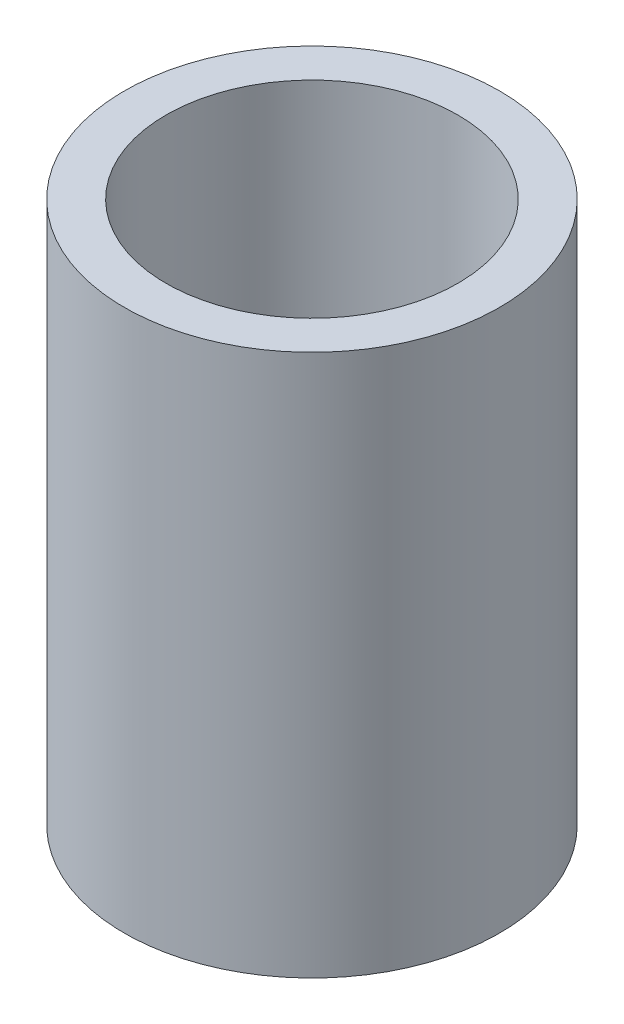
ISO-10303-21;
HEADER;
FILE_DESCRIPTION(('STEP AP214'),'2;1');
FILE_NAME('part.step','',(''),(''),'','','');
FILE_SCHEMA(('AUTOMOTIVE_DESIGN { 1 0 10303 214 1 1 1 1 }'));
ENDSEC;
DATA;
#1=APPLICATION_CONTEXT('core data for automotive mechanical design processes');
#2=APPLICATION_PROTOCOL_DEFINITION('international standard','automotive_design',2000,#1);
#3=PRODUCT_CONTEXT('',#1,'mechanical');
#4=PRODUCT('Part','Part','',(#3));
#5=PRODUCT_RELATED_PRODUCT_CATEGORY('part','',(#4));
#6=PRODUCT_DEFINITION_FORMATION('','',#4);
#7=PRODUCT_DEFINITION_CONTEXT('part definition',#1,'design');
#8=PRODUCT_DEFINITION('design','',#6,#7);
#9=PRODUCT_DEFINITION_SHAPE('','',#8);
#10=(LENGTH_UNIT() NAMED_UNIT(*) SI_UNIT(.MILLI.,.METRE.));
#11=(NAMED_UNIT(*) PLANE_ANGLE_UNIT() SI_UNIT($,.RADIAN.));
#12=(NAMED_UNIT(*) SI_UNIT($,.STERADIAN.) SOLID_ANGLE_UNIT());
#13=UNCERTAINTY_MEASURE_WITH_UNIT(LENGTH_MEASURE(1.E-05),#10,'distance_accuracy_value','');
#14=(GEOMETRIC_REPRESENTATION_CONTEXT(3) GLOBAL_UNCERTAINTY_ASSIGNED_CONTEXT((#13)) GLOBAL_UNIT_ASSIGNED_CONTEXT((#10,
#11,#12)) REPRESENTATION_CONTEXT('',''));
#15=CARTESIAN_POINT('',(0.,0.,0.));
#16=DIRECTION('',(0.,0.,1.));
#17=DIRECTION('',(1.,0.,0.));
#18=AXIS2_PLACEMENT_3D('',#15,#16,#17);
#19=CARTESIAN_POINT('',(0.,13.,0.));
#20=DIRECTION('',(0.,1.,0.));
#21=DIRECTION('',(0.,0.,1.));
#22=AXIS2_PLACEMENT_3D('',#19,#20,#21);
#23=PLANE('',#22);
#24=CARTESIAN_POINT('',(0.,13.,0.));
#25=DIRECTION('',(0.,1.,0.));
#26=DIRECTION('',(0.,0.,1.));
#27=AXIS2_PLACEMENT_3D('',#24,#25,#26);
#28=CIRCLE('',#27,4.5);
#29=CARTESIAN_POINT('',(0.,13.,-4.5));
#30=VERTEX_POINT('',#29);
#31=EDGE_CURVE('E10',#30,#30,#28,.T.);
#32=ORIENTED_EDGE('',*,*,#31,.T.);
#33=EDGE_LOOP('',(#32));
#34=FACE_BOUND('',#33,.T.);
#35=CARTESIAN_POINT('',(0.,13.,0.));
#36=DIRECTION('',(0.,1.,0.));
#37=DIRECTION('',(0.,0.,1.));
#38=AXIS2_PLACEMENT_3D('',#35,#36,#37);
#39=CIRCLE('',#38,3.5);
#40=CARTESIAN_POINT('',(0.,13.,-3.5));
#41=VERTEX_POINT('',#40);
#42=EDGE_CURVE('E44',#41,#41,#39,.T.);
#43=ORIENTED_EDGE('',*,*,#42,.F.);
#44=EDGE_LOOP('',(#43));
#45=FACE_BOUND('',#44,.T.);
#46=ADVANCED_FACE('F33',(#34,#45),#23,.T.);
#47=CARTESIAN_POINT('',(0.,0.,0.));
#48=DIRECTION('',(0.,1.,0.));
#49=DIRECTION('',(0.,0.,1.));
#50=AXIS2_PLACEMENT_3D('',#47,#48,#49);
#51=PLANE('',#50);
#52=CARTESIAN_POINT('',(0.,0.,0.));
#53=DIRECTION('',(0.,1.,0.));
#54=DIRECTION('',(0.,0.,1.));
#55=AXIS2_PLACEMENT_3D('',#52,#53,#54);
#56=CIRCLE('',#55,4.5);
#57=CARTESIAN_POINT('',(0.,0.,-4.5));
#58=VERTEX_POINT('',#57);
#59=EDGE_CURVE('E37',#58,#58,#56,.T.);
#60=ORIENTED_EDGE('',*,*,#59,.F.);
#61=EDGE_LOOP('',(#60));
#62=FACE_BOUND('',#61,.T.);
#63=CARTESIAN_POINT('',(0.,0.,0.));
#64=DIRECTION('',(0.,1.,0.));
#65=DIRECTION('',(0.,0.,1.));
#66=AXIS2_PLACEMENT_3D('',#63,#64,#65);
#67=CIRCLE('',#66,3.5);
#68=CARTESIAN_POINT('',(0.,0.,-3.5));
#69=VERTEX_POINT('',#68);
#70=EDGE_CURVE('E46',#69,#69,#67,.T.);
#71=ORIENTED_EDGE('',*,*,#70,.T.);
#72=EDGE_LOOP('',(#71));
#73=FACE_BOUND('',#72,.T.);
#74=ADVANCED_FACE('F56',(#62,#73),#51,.F.);
#75=CARTESIAN_POINT('',(0.,13.,0.));
#76=DIRECTION('',(0.,-1.,0.));
#77=DIRECTION('',(0.,0.,-1.));
#78=AXIS2_PLACEMENT_3D('',#75,#76,#77);
#79=CYLINDRICAL_SURFACE('',#78,4.5);
#80=CARTESIAN_POINT('',(0.,13.,-4.5));
#81=CARTESIAN_POINT('',(0.,12.8645833333333,-4.5));
#82=CARTESIAN_POINT('',(0.,12.7291666666667,-4.5));
#83=CARTESIAN_POINT('',(0.,12.4583333333333,-4.5));
#84=CARTESIAN_POINT('',(0.,12.3229166666667,-4.5));
#85=CARTESIAN_POINT('',(0.,12.0520833333333,-4.5));
#86=CARTESIAN_POINT('',(0.,11.9166666666667,-4.5));
#87=CARTESIAN_POINT('',(0.,11.6458333333333,-4.5));
#88=CARTESIAN_POINT('',(0.,11.5104166666667,-4.5));
#89=CARTESIAN_POINT('',(0.,11.2395833333333,-4.5));
#90=CARTESIAN_POINT('',(0.,11.1041666666667,-4.5));
#91=CARTESIAN_POINT('',(0.,10.8333333333333,-4.5));
#92=CARTESIAN_POINT('',(0.,10.6979166666667,-4.5));
#93=CARTESIAN_POINT('',(0.,10.4270833333333,-4.5));
#94=CARTESIAN_POINT('',(0.,10.2916666666667,-4.5));
#95=CARTESIAN_POINT('',(0.,10.0208333333333,-4.5));
#96=CARTESIAN_POINT('',(0.,9.88541666666667,-4.5));
#97=CARTESIAN_POINT('',(0.,9.61458333333333,-4.5));
#98=CARTESIAN_POINT('',(0.,9.47916666666667,-4.5));
#99=CARTESIAN_POINT('',(0.,9.20833333333333,-4.5));
#100=CARTESIAN_POINT('',(0.,9.07291666666667,-4.5));
#101=CARTESIAN_POINT('',(0.,8.80208333333333,-4.5));
#102=CARTESIAN_POINT('',(0.,8.66666666666667,-4.5));
#103=CARTESIAN_POINT('',(0.,8.39583333333333,-4.5));
#104=CARTESIAN_POINT('',(0.,8.26041666666667,-4.5));
#105=CARTESIAN_POINT('',(0.,7.98958333333333,-4.5));
#106=CARTESIAN_POINT('',(0.,7.85416666666667,-4.5));
#107=CARTESIAN_POINT('',(0.,7.58333333333333,-4.5));
#108=CARTESIAN_POINT('',(0.,7.44791666666667,-4.5));
#109=CARTESIAN_POINT('',(0.,7.17708333333333,-4.5));
#110=CARTESIAN_POINT('',(0.,7.04166666666667,-4.5));
#111=CARTESIAN_POINT('',(0.,6.77083333333333,-4.5));
#112=CARTESIAN_POINT('',(0.,6.63541666666667,-4.5));
#113=CARTESIAN_POINT('',(0.,6.36458333333333,-4.5));
#114=CARTESIAN_POINT('',(0.,6.22916666666667,-4.5));
#115=CARTESIAN_POINT('',(0.,5.95833333333333,-4.5));
#116=CARTESIAN_POINT('',(0.,5.82291666666667,-4.5));
#117=CARTESIAN_POINT('',(0.,5.55208333333333,-4.5));
#118=CARTESIAN_POINT('',(0.,5.41666666666667,-4.5));
#119=CARTESIAN_POINT('',(0.,5.14583333333333,-4.5));
#120=CARTESIAN_POINT('',(0.,5.01041666666667,-4.5));
#121=CARTESIAN_POINT('',(0.,4.73958333333333,-4.5));
#122=CARTESIAN_POINT('',(0.,4.60416666666667,-4.5));
#123=CARTESIAN_POINT('',(0.,4.33333333333333,-4.5));
#124=CARTESIAN_POINT('',(0.,4.19791666666667,-4.5));
#125=CARTESIAN_POINT('',(0.,3.92708333333333,-4.5));
#126=CARTESIAN_POINT('',(0.,3.79166666666667,-4.5));
#127=CARTESIAN_POINT('',(0.,3.52083333333333,-4.5));
#128=CARTESIAN_POINT('',(0.,3.38541666666667,-4.5));
#129=CARTESIAN_POINT('',(0.,3.11458333333333,-4.5));
#130=CARTESIAN_POINT('',(0.,2.97916666666667,-4.5));
#131=CARTESIAN_POINT('',(0.,2.70833333333333,-4.5));
#132=CARTESIAN_POINT('',(0.,2.57291666666667,-4.5));
#133=CARTESIAN_POINT('',(0.,2.30208333333333,-4.5));
#134=CARTESIAN_POINT('',(0.,2.16666666666667,-4.5));
#135=CARTESIAN_POINT('',(0.,1.89583333333333,-4.5));
#136=CARTESIAN_POINT('',(0.,1.76041666666667,-4.5));
#137=CARTESIAN_POINT('',(0.,1.48958333333333,-4.5));
#138=CARTESIAN_POINT('',(0.,1.35416666666667,-4.5));
#139=CARTESIAN_POINT('',(0.,1.08333333333333,-4.5));
#140=CARTESIAN_POINT('',(0.,0.947916666666667,-4.5));
#141=CARTESIAN_POINT('',(0.,0.677083333333334,-4.5));
#142=CARTESIAN_POINT('',(0.,0.541666666666667,-4.5));
#143=CARTESIAN_POINT('',(0.,0.270833333333334,-4.5));
#144=CARTESIAN_POINT('',(0.,0.135416666666667,-4.5));
#145=CARTESIAN_POINT('',(0.,0.,-4.5));
#146=B_SPLINE_CURVE_WITH_KNOTS('',3,(#80,#81,#82,#83,#84,#85,#86,#87,#88,#89,#90,#91,#92,#93,
#94,#95,#96,#97,#98,#99,#100,#101,#102,#103,#104,#105,#106,#107,#108,#109,#110,#111,#112,#113,
#114,#115,#116,#117,#118,#119,#120,#121,#122,#123,#124,#125,#126,#127,#128,#129,#130,#131,#132,
#133,#134,#135,#136,#137,#138,#139,#140,#141,#142,#143,#144,#145),.UNSPECIFIED.,.F.,.F.,(4,2,2,
2,2,2,2,2,2,2,2,2,2,2,2,2,2,2,2,2,2,2,2,2,2,2,2,2,2,2,2,2,4),(0.,0.406249999999999,
0.812499999999999,1.21875,1.625,2.03125,2.4375,2.84375,3.25,3.65625,4.0625,4.46875,4.875,
5.28125,5.6875,6.09375,6.5,6.90625,7.3125,7.71875,8.125,8.53125,8.9375,9.34375,9.75,10.15625,
10.5625,10.96875,11.375,11.78125,12.1875,12.59375,13.),.UNSPECIFIED.);
#147=EDGE_CURVE('BSEAM35',#30,#58,#146,.T.);
#148=ORIENTED_EDGE('',*,*,#31,.F.);
#149=ORIENTED_EDGE('',*,*,#59,.T.);
#150=ORIENTED_EDGE('',*,*,#147,.T.);
#151=ORIENTED_EDGE('',*,*,#147,.F.);
#152=EDGE_LOOP('',(#148,#150,#149,#151));
#153=FACE_BOUND('',#152,.T.);
#154=ADVANCED_FACE('F35',(#153),#79,.T.);
#155=CARTESIAN_POINT('',(0.,13.,0.));
#156=DIRECTION('',(0.,-1.,0.));
#157=DIRECTION('',(0.,0.,-1.));
#158=AXIS2_PLACEMENT_3D('',#155,#156,#157);
#159=CYLINDRICAL_SURFACE('',#158,3.5);
#160=CARTESIAN_POINT('',(0.,13.,-3.5));
#161=CARTESIAN_POINT('',(0.,12.8645833333333,-3.5));
#162=CARTESIAN_POINT('',(0.,12.7291666666667,-3.5));
#163=CARTESIAN_POINT('',(0.,12.4583333333333,-3.5));
#164=CARTESIAN_POINT('',(0.,12.3229166666667,-3.5));
#165=CARTESIAN_POINT('',(0.,12.0520833333333,-3.5));
#166=CARTESIAN_POINT('',(0.,11.9166666666667,-3.5));
#167=CARTESIAN_POINT('',(0.,11.6458333333333,-3.5));
#168=CARTESIAN_POINT('',(0.,11.5104166666667,-3.5));
#169=CARTESIAN_POINT('',(0.,11.2395833333333,-3.5));
#170=CARTESIAN_POINT('',(0.,11.1041666666667,-3.5));
#171=CARTESIAN_POINT('',(0.,10.8333333333333,-3.5));
#172=CARTESIAN_POINT('',(0.,10.6979166666667,-3.5));
#173=CARTESIAN_POINT('',(0.,10.4270833333333,-3.5));
#174=CARTESIAN_POINT('',(0.,10.2916666666667,-3.5));
#175=CARTESIAN_POINT('',(0.,10.0208333333333,-3.5));
#176=CARTESIAN_POINT('',(0.,9.88541666666667,-3.5));
#177=CARTESIAN_POINT('',(0.,9.61458333333333,-3.5));
#178=CARTESIAN_POINT('',(0.,9.47916666666667,-3.5));
#179=CARTESIAN_POINT('',(0.,9.20833333333333,-3.5));
#180=CARTESIAN_POINT('',(0.,9.07291666666667,-3.5));
#181=CARTESIAN_POINT('',(0.,8.80208333333333,-3.5));
#182=CARTESIAN_POINT('',(0.,8.66666666666667,-3.5));
#183=CARTESIAN_POINT('',(0.,8.39583333333333,-3.5));
#184=CARTESIAN_POINT('',(0.,8.26041666666667,-3.5));
#185=CARTESIAN_POINT('',(0.,7.98958333333333,-3.5));
#186=CARTESIAN_POINT('',(0.,7.85416666666667,-3.5));
#187=CARTESIAN_POINT('',(0.,7.58333333333333,-3.5));
#188=CARTESIAN_POINT('',(0.,7.44791666666667,-3.5));
#189=CARTESIAN_POINT('',(0.,7.17708333333333,-3.5));
#190=CARTESIAN_POINT('',(0.,7.04166666666667,-3.5));
#191=CARTESIAN_POINT('',(0.,6.77083333333333,-3.5));
#192=CARTESIAN_POINT('',(0.,6.63541666666667,-3.5));
#193=CARTESIAN_POINT('',(0.,6.36458333333333,-3.5));
#194=CARTESIAN_POINT('',(0.,6.22916666666667,-3.5));
#195=CARTESIAN_POINT('',(0.,5.95833333333333,-3.5));
#196=CARTESIAN_POINT('',(0.,5.82291666666667,-3.5));
#197=CARTESIAN_POINT('',(0.,5.55208333333333,-3.5));
#198=CARTESIAN_POINT('',(0.,5.41666666666667,-3.5));
#199=CARTESIAN_POINT('',(0.,5.14583333333333,-3.5));
#200=CARTESIAN_POINT('',(0.,5.01041666666667,-3.5));
#201=CARTESIAN_POINT('',(0.,4.73958333333333,-3.5));
#202=CARTESIAN_POINT('',(0.,4.60416666666667,-3.5));
#203=CARTESIAN_POINT('',(0.,4.33333333333333,-3.5));
#204=CARTESIAN_POINT('',(0.,4.19791666666667,-3.5));
#205=CARTESIAN_POINT('',(0.,3.92708333333333,-3.5));
#206=CARTESIAN_POINT('',(0.,3.79166666666667,-3.5));
#207=CARTESIAN_POINT('',(0.,3.52083333333333,-3.5));
#208=CARTESIAN_POINT('',(0.,3.38541666666667,-3.5));
#209=CARTESIAN_POINT('',(0.,3.11458333333333,-3.5));
#210=CARTESIAN_POINT('',(0.,2.97916666666667,-3.5));
#211=CARTESIAN_POINT('',(0.,2.70833333333333,-3.5));
#212=CARTESIAN_POINT('',(0.,2.57291666666667,-3.5));
#213=CARTESIAN_POINT('',(0.,2.30208333333333,-3.5));
#214=CARTESIAN_POINT('',(0.,2.16666666666667,-3.5));
#215=CARTESIAN_POINT('',(0.,1.89583333333333,-3.5));
#216=CARTESIAN_POINT('',(0.,1.76041666666667,-3.5));
#217=CARTESIAN_POINT('',(0.,1.48958333333333,-3.5));
#218=CARTESIAN_POINT('',(0.,1.35416666666667,-3.5));
#219=CARTESIAN_POINT('',(0.,1.08333333333333,-3.5));
#220=CARTESIAN_POINT('',(0.,0.947916666666667,-3.5));
#221=CARTESIAN_POINT('',(0.,0.677083333333334,-3.5));
#222=CARTESIAN_POINT('',(0.,0.541666666666667,-3.5));
#223=CARTESIAN_POINT('',(0.,0.270833333333334,-3.5));
#224=CARTESIAN_POINT('',(0.,0.135416666666667,-3.5));
#225=CARTESIAN_POINT('',(0.,0.,-3.5));
#226=B_SPLINE_CURVE_WITH_KNOTS('',3,(#160,#161,#162,#163,#164,#165,#166,#167,#168,#169,#170,
#171,#172,#173,#174,#175,#176,#177,#178,#179,#180,#181,#182,#183,#184,#185,#186,#187,#188,#189,
#190,#191,#192,#193,#194,#195,#196,#197,#198,#199,#200,#201,#202,#203,#204,#205,#206,#207,#208,
#209,#210,#211,#212,#213,#214,#215,#216,#217,#218,#219,#220,#221,#222,#223,#224,#225),
.UNSPECIFIED.,.F.,.F.,(4,2,2,2,2,2,2,2,2,2,2,2,2,2,2,2,2,2,2,2,2,2,2,2,2,2,2,2,2,2,2,2,4),(0.,
0.406249999999999,0.812499999999999,1.21875,1.625,2.03125,2.4375,2.84375,3.25,3.65625,4.0625,
4.46875,4.875,5.28125,5.6875,6.09375,6.5,6.90625,7.3125,7.71875,8.125,8.53125,8.9375,9.34375,
9.75,10.15625,10.5625,10.96875,11.375,11.78125,12.1875,12.59375,13.),.UNSPECIFIED.);
#227=EDGE_CURVE('BSEAM52',#41,#69,#226,.T.);
#228=ORIENTED_EDGE('',*,*,#42,.T.);
#229=ORIENTED_EDGE('',*,*,#70,.F.);
#230=ORIENTED_EDGE('',*,*,#227,.T.);
#231=ORIENTED_EDGE('',*,*,#227,.F.);
#232=EDGE_LOOP('',(#228,#230,#229,#231));
#233=FACE_BOUND('',#232,.T.);
#234=ADVANCED_FACE('F52',(#233),#159,.F.);
#235=CLOSED_SHELL('',(#46,#74,#154,#234));
#236=MANIFOLD_SOLID_BREP('B2',#235);
#237=ADVANCED_BREP_SHAPE_REPRESENTATION('',(#18,#236),#14);
#238=SHAPE_DEFINITION_REPRESENTATION(#9,#237);
ENDSEC;
END-ISO-10303-21;
